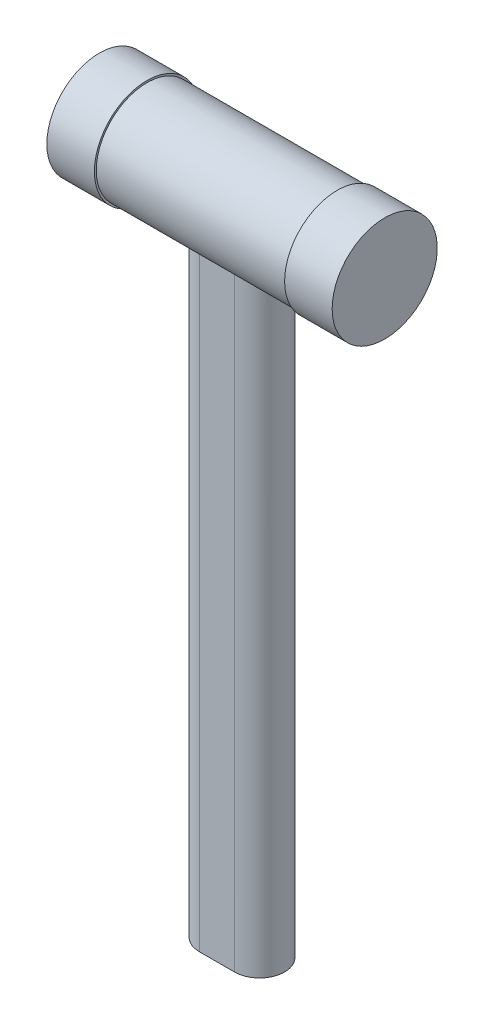
ISO-10303-21;
HEADER;
FILE_DESCRIPTION(('STEP AP214'),'2;1');
FILE_NAME('part.step','',(''),(''),'','','');
FILE_SCHEMA(('AUTOMOTIVE_DESIGN { 1 0 10303 214 1 1 1 1 }'));
ENDSEC;
DATA;
#1=APPLICATION_CONTEXT('core data for automotive mechanical design processes');
#2=APPLICATION_PROTOCOL_DEFINITION('international standard','automotive_design',2000,#1);
#3=PRODUCT_CONTEXT('',#1,'mechanical');
#4=PRODUCT('Part','Part','',(#3));
#5=PRODUCT_RELATED_PRODUCT_CATEGORY('part','',(#4));
#6=PRODUCT_DEFINITION_FORMATION('','',#4);
#7=PRODUCT_DEFINITION_CONTEXT('part definition',#1,'design');
#8=PRODUCT_DEFINITION('design','',#6,#7);
#9=PRODUCT_DEFINITION_SHAPE('','',#8);
#10=(LENGTH_UNIT() NAMED_UNIT(*) SI_UNIT(.MILLI.,.METRE.));
#11=(NAMED_UNIT(*) PLANE_ANGLE_UNIT() SI_UNIT($,.RADIAN.));
#12=(NAMED_UNIT(*) SI_UNIT($,.STERADIAN.) SOLID_ANGLE_UNIT());
#13=UNCERTAINTY_MEASURE_WITH_UNIT(LENGTH_MEASURE(1.E-05),#10,'distance_accuracy_value','');
#14=(GEOMETRIC_REPRESENTATION_CONTEXT(3) GLOBAL_UNCERTAINTY_ASSIGNED_CONTEXT((#13)) GLOBAL_UNIT_ASSIGNED_CONTEXT((#10,
#11,#12)) REPRESENTATION_CONTEXT('',''));
#15=CARTESIAN_POINT('',(0.,0.,0.));
#16=DIRECTION('',(0.,0.,1.));
#17=DIRECTION('',(1.,0.,0.));
#18=AXIS2_PLACEMENT_3D('',#15,#16,#17);
#19=CARTESIAN_POINT('',(-67.2475280945225,0.,0.));
#20=DIRECTION('',(-1.,0.,0.));
#21=DIRECTION('',(0.,0.,1.));
#22=AXIS2_PLACEMENT_3D('',#19,#20,#21);
#23=CYLINDRICAL_SURFACE('',#22,20.25);
#24=CARTESIAN_POINT('',(-7.,-17.6085916529403,10.));
#25=CARTESIAN_POINT('',(-7.13119469611353,-17.6085887085674,10.0000009562835));
#26=CARTESIAN_POINT('',(-7.26237096669667,-17.6100584813515,9.99741763580757));
#27=CARTESIAN_POINT('',(-7.52444877218274,-17.6159132625807,9.98709923847474));
#28=CARTESIAN_POINT('',(-7.65535032119536,-17.6202981174399,9.97936443303218));
#29=CARTESIAN_POINT('',(-8.04709113774775,-17.637770625517,9.94847458192275));
#30=CARTESIAN_POINT('',(-8.30718392901733,-17.6551763207532,9.91763404104645));
#31=CARTESIAN_POINT('',(-8.82172191477253,-17.7007291317959,9.83609851650981));
#32=CARTESIAN_POINT('',(-9.0761906004808,-17.7288154649931,9.78551584153814));
#33=CARTESIAN_POINT('',(-9.57926227381594,-17.7947435006415,9.66510776126199));
#34=CARTESIAN_POINT('',(-9.82786460819568,-17.8325862839782,9.59528022382229));
#35=CARTESIAN_POINT('',(-10.3170575060674,-17.9166803871335,9.43732161029125));
#36=CARTESIAN_POINT('',(-10.5576653041822,-17.9629120137454,9.34923333457524));
#37=CARTESIAN_POINT('',(-11.030223745024,-18.0624410057381,9.15546714449136));
#38=CARTESIAN_POINT('',(-11.2621709877771,-18.1157411094615,9.04978240914398));
#39=CARTESIAN_POINT('',(-11.9437340177426,-18.2841262909816,8.70735460386789));
#40=CARTESIAN_POINT('',(-12.3788157151471,-18.407649743781,8.44532126760743));
#41=CARTESIAN_POINT('',(-13.2353011040794,-18.6751854076638,7.83699797809553));
#42=CARTESIAN_POINT('',(-13.6528538958929,-18.8200459124759,7.48565872431166));
#43=CARTESIAN_POINT('',(-14.2324680791168,-19.0352031693265,6.91126544038948));
#44=CARTESIAN_POINT('',(-14.4179874827369,-19.1066102833636,6.71176518828111));
#45=CARTESIAN_POINT('',(-14.7724860926097,-19.2470138928763,6.29782791076951));
#46=CARTESIAN_POINT('',(-14.9414712835092,-19.3160112547162,6.08339633830036));
#47=CARTESIAN_POINT('',(-15.2724238948371,-19.454342164989,5.6259985323348));
#48=CARTESIAN_POINT('',(-15.4331969381054,-19.5233988129817,5.38208311950838));
#49=CARTESIAN_POINT('',(-15.7334660217533,-19.6549666094938,4.87977260064799));
#50=CARTESIAN_POINT('',(-15.8729608718957,-19.7174773917962,4.62137668572359));
#51=CARTESIAN_POINT('',(-16.1292376338619,-19.8341237283768,4.09188039767164));
#52=CARTESIAN_POINT('',(-16.2460301608737,-19.8882631944943,3.82078603604736));
#53=CARTESIAN_POINT('',(-16.4556490456701,-19.9865760546697,3.26773954131227));
#54=CARTESIAN_POINT('',(-16.5484778784218,-20.0307504778563,2.98578853293365));
#55=CARTESIAN_POINT('',(-16.7033875390429,-20.1050726351309,2.43326174131738));
#56=CARTESIAN_POINT('',(-16.7671603029062,-20.1359833248814,2.16326248898703));
#57=CARTESIAN_POINT('',(-16.8721553419112,-20.18712070987,1.61791206458623));
#58=CARTESIAN_POINT('',(-16.9133785767735,-20.2073478598042,1.34256112080333));
#59=CARTESIAN_POINT('',(-16.9727169559281,-20.2365243035953,0.788918292470951));
#60=CARTESIAN_POINT('',(-16.9908431716296,-20.2454790008057,0.510627881488825));
#61=CARTESIAN_POINT('',(-17.0037735113296,-20.2518628415792,-0.0466195808597257));
#62=CARTESIAN_POINT('',(-16.9985790162926,-20.2492926676017,-0.325576591774926));
#63=CARTESIAN_POINT('',(-16.9663784108316,-20.2334137760344,-0.858075358398231));
#64=CARTESIAN_POINT('',(-16.9412637337405,-20.2210363626956,-1.11176202804301));
#65=CARTESIAN_POINT('',(-16.8718663001748,-20.1870088973892,-1.61585199525056));
#66=CARTESIAN_POINT('',(-16.8275848591758,-20.1653594817896,-1.8662555169312));
#67=CARTESIAN_POINT('',(-16.7203323527073,-20.1133081641697,-2.36209317779882));
#68=CARTESIAN_POINT('',(-16.6573610377543,-20.0829061453146,-2.60752725060394));
#69=CARTESIAN_POINT('',(-16.5133659376076,-20.0140609814431,-3.09187861640992));
#70=CARTESIAN_POINT('',(-16.4323415125202,-19.9756175514014,-3.33079567807797));
#71=CARTESIAN_POINT('',(-16.251738322524,-19.8909704379378,-3.80399040846188));
#72=CARTESIAN_POINT('',(-16.1519183012321,-19.8446667227684,-4.03815811537233));
#73=CARTESIAN_POINT('',(-15.9353227454781,-19.7457145422005,-4.49716328221882));
#74=CARTESIAN_POINT('',(-15.8185411955624,-19.6930638269517,-4.72199739544196));
#75=CARTESIAN_POINT('',(-15.4440853089328,-19.5272817634961,-5.38073764441857));
#76=CARTESIAN_POINT('',(-15.1621929093053,-19.4062688251405,-5.799159142037));
#77=CARTESIAN_POINT('',(-14.5119417192443,-19.1414654815417,-6.6235492778595));
#78=CARTESIAN_POINT('',(-14.1379891319994,-18.996603497,-7.02476595586027));
#79=CARTESIAN_POINT('',(-13.5319189133597,-18.7801189681896,-7.5768707072095));
#80=CARTESIAN_POINT('',(-13.322188479109,-18.7080356060818,-7.75273808014846));
#81=CARTESIAN_POINT('',(-12.8884808337016,-18.565955930487,-8.08707110172042));
#82=CARTESIAN_POINT('',(-12.6645014744838,-18.4959599340226,-8.24553411673882));
#83=CARTESIAN_POINT('',(-12.1891474142513,-18.3557905007538,-8.55323357500701));
#84=CARTESIAN_POINT('',(-11.9369351132936,-18.2858734663001,-8.70129448320943));
#85=CARTESIAN_POINT('',(-11.4191770098272,-18.1529359822651,-8.97533319228321));
#86=CARTESIAN_POINT('',(-11.1536373826481,-18.0899123808158,-9.10132110153054));
#87=CARTESIAN_POINT('',(-10.6112332456041,-17.9731326323965,-9.32981517307728));
#88=CARTESIAN_POINT('',(-10.3343894964553,-17.9193603652161,-9.43236228499333));
#89=CARTESIAN_POINT('',(-9.77097324841326,-17.823127715097,-9.6129664289586));
#90=CARTESIAN_POINT('',(-9.48440503974579,-17.780662415072,-9.69103410906627));
#91=CARTESIAN_POINT('',(-9.01530688465895,-17.7226514787911,-9.79654031652647));
#92=CARTESIAN_POINT('',(-8.83502201646602,-17.7030274976721,-9.8319137326667));
#93=CARTESIAN_POINT('',(-8.47232088402276,-17.6691157375659,-9.89272778365913));
#94=CARTESIAN_POINT('',(-8.28990522372591,-17.6548264826158,-9.91817116594995));
#95=CARTESIAN_POINT('',(-7.92332191215859,-17.6318335238548,-9.9589922554542));
#96=CARTESIAN_POINT('',(-7.73915203078704,-17.6231382892473,-9.97435470108786));
#97=CARTESIAN_POINT('',(-7.36999100564903,-17.6115065672525,-9.99486666032168));
#98=CARTESIAN_POINT('',(-7.18499956549196,-17.6085723621322,-10.0000121264121));
#99=CARTESIAN_POINT('',(-7.,-17.6085916529403,-10.));
#100=B_SPLINE_CURVE_WITH_KNOTS('',3,(#24,#25,#26,#27,#28,#29,#30,#31,#32,#33,#34,#35,#36,#37,
#38,#39,#40,#41,#42,#43,#44,#45,#46,#47,#48,#49,#50,#51,#52,#53,#54,#55,#56,#57,#58,#59,#60,#61,
#62,#63,#64,#65,#66,#67,#68,#69,#70,#71,#72,#73,#74,#75,#76,#77,#78,#79,#80,#81,#82,#83,#84,#85,
#86,#87,#88,#89,#90,#91,#92,#93,#94,#95,#96,#97,#98,#99),.UNSPECIFIED.,.F.,.F.,(4,2,2,2,2,2,2,2,
2,2,2,2,2,2,2,2,2,2,2,2,2,2,2,2,2,2,2,2,2,2,2,2,2,2,2,2,2,4),(0.,0.393514021452711,
0.787007311622309,1.57334423069151,2.35527156505003,3.13728556386049,3.91748695578856,
4.69799148713889,6.25980931859988,7.94604918064989,8.79021658878735,9.63407730682369,
10.53349182625,11.4329566377442,12.3319998590077,13.2309501900289,14.0672552485545,
14.9035247107047,15.7393931614249,16.5752121158227,17.3399895601438,18.1047145236906,
18.8694496956967,19.6342119780952,20.4095578293316,21.1851793336473,22.7355269392181,
24.4296255662743,25.278015648434,26.126533931998,27.0274943155965,27.9280410178472,
28.8270022887464,29.7255719854635,30.2795594507784,30.8333935301696,31.3880641391161,
31.9429544399114),.UNSPECIFIED.);
#101=CARTESIAN_POINT('',(-7.,-17.6085916529403,10.));
#102=VERTEX_POINT('',#101);
#103=CARTESIAN_POINT('',(-7.,-17.6085916529404,-9.99999999999999));
#104=VERTEX_POINT('',#103);
#105=EDGE_CURVE('E11',#102,#104,#100,.T.);
#106=ORIENTED_EDGE('',*,*,#105,.F.);
#107=DIRECTION('',(-1.,0.,0.));
#108=VECTOR('',#107,1.);
#109=CARTESIAN_POINT('',(-67.2475280945225,-17.6085916529403,10.));
#110=LINE('',#109,#108);
#111=CARTESIAN_POINT('',(7.00000000000001,-17.6085916529403,10.));
#112=VERTEX_POINT('',#111);
#113=EDGE_CURVE('E85',#112,#102,#110,.T.);
#114=ORIENTED_EDGE('',*,*,#113,.F.);
#115=CARTESIAN_POINT('',(7.,-17.6085916529403,-10.));
#116=CARTESIAN_POINT('',(7.13119469611353,-17.6085887085674,-10.0000009562835));
#117=CARTESIAN_POINT('',(7.26237096669667,-17.6100584813515,-9.99741763580757));
#118=CARTESIAN_POINT('',(7.52444877218274,-17.6159132625807,-9.98709923847474));
#119=CARTESIAN_POINT('',(7.65535032119536,-17.6202981174399,-9.97936443303219));
#120=CARTESIAN_POINT('',(8.04709113774775,-17.637770625517,-9.94847458192275));
#121=CARTESIAN_POINT('',(8.30718392901732,-17.6551763207532,-9.91763404104645));
#122=CARTESIAN_POINT('',(8.82172191477252,-17.7007291317959,-9.83609851650981));
#123=CARTESIAN_POINT('',(9.07619060048079,-17.7288154649931,-9.78551584153814));
#124=CARTESIAN_POINT('',(9.57926227381593,-17.7947435006415,-9.665107761262));
#125=CARTESIAN_POINT('',(9.82786460819567,-17.8325862839782,-9.5952802238223));
#126=CARTESIAN_POINT('',(10.3170575060674,-17.9166803871335,-9.43732161029125));
#127=CARTESIAN_POINT('',(10.5576653041822,-17.9629120137454,-9.34923333457525));
#128=CARTESIAN_POINT('',(11.030223745024,-18.0624410057381,-9.15546714449137));
#129=CARTESIAN_POINT('',(11.2621709877771,-18.1157411094615,-9.04978240914399));
#130=CARTESIAN_POINT('',(11.9437340177426,-18.2841262909816,-8.7073546038679));
#131=CARTESIAN_POINT('',(12.3788157151471,-18.407649743781,-8.44532126760743));
#132=CARTESIAN_POINT('',(13.2353011040794,-18.6751854076638,-7.83699797809554));
#133=CARTESIAN_POINT('',(13.6528538958929,-18.8200459124759,-7.48565872431167));
#134=CARTESIAN_POINT('',(14.2324680791168,-19.0352031693265,-6.91126544038949));
#135=CARTESIAN_POINT('',(14.4179874827369,-19.1066102833636,-6.71176518828112));
#136=CARTESIAN_POINT('',(14.7724860926097,-19.2470138928763,-6.29782791076952));
#137=CARTESIAN_POINT('',(14.9414712835092,-19.3160112547162,-6.08339633830037));
#138=CARTESIAN_POINT('',(15.272423894837,-19.454342164989,-5.62599853233482));
#139=CARTESIAN_POINT('',(15.4331969381054,-19.5233988129817,-5.3820831195084));
#140=CARTESIAN_POINT('',(15.7334660217533,-19.6549666094938,-4.87977260064801));
#141=CARTESIAN_POINT('',(15.8729608718957,-19.7174773917962,-4.62137668572361));
#142=CARTESIAN_POINT('',(16.1292376338619,-19.8341237283767,-4.09188039767166));
#143=CARTESIAN_POINT('',(16.2460301608737,-19.8882631944943,-3.82078603604738));
#144=CARTESIAN_POINT('',(16.4556490456701,-19.9865760546697,-3.26773954131229));
#145=CARTESIAN_POINT('',(16.5484778784217,-20.0307504778563,-2.98578853293367));
#146=CARTESIAN_POINT('',(16.7033875390429,-20.1050726351309,-2.4332617413174));
#147=CARTESIAN_POINT('',(16.7671603029062,-20.1359833248814,-2.16326248898704));
#148=CARTESIAN_POINT('',(16.8721553419112,-20.18712070987,-1.61791206458625));
#149=CARTESIAN_POINT('',(16.9133785767735,-20.2073478598042,-1.34256112080335));
#150=CARTESIAN_POINT('',(16.9727169559281,-20.2365243035953,-0.788918292470969));
#151=CARTESIAN_POINT('',(16.9908431716296,-20.2454790008057,-0.510627881488843));
#152=CARTESIAN_POINT('',(17.0037735113296,-20.2518628415792,0.0466195808597077));
#153=CARTESIAN_POINT('',(16.9985790162926,-20.2492926676017,0.325576591774908));
#154=CARTESIAN_POINT('',(16.9663784108316,-20.2334137760344,0.858075358398214));
#155=CARTESIAN_POINT('',(16.9412637337405,-20.2210363626956,1.11176202804299));
#156=CARTESIAN_POINT('',(16.8718663001748,-20.1870088973892,1.61585199525054));
#157=CARTESIAN_POINT('',(16.8275848591758,-20.1653594817896,1.86625551693119));
#158=CARTESIAN_POINT('',(16.7203323527073,-20.1133081641697,2.36209317779881));
#159=CARTESIAN_POINT('',(16.6573610377543,-20.0829061453146,2.60752725060392));
#160=CARTESIAN_POINT('',(16.5133659376076,-20.0140609814431,3.09187861640991));
#161=CARTESIAN_POINT('',(16.4323415125202,-19.9756175514014,3.33079567807796));
#162=CARTESIAN_POINT('',(16.251738322524,-19.8909704379378,3.80399040846187));
#163=CARTESIAN_POINT('',(16.1519183012321,-19.8446667227684,4.03815811537231));
#164=CARTESIAN_POINT('',(15.9353227454781,-19.7457145422005,4.4971632822188));
#165=CARTESIAN_POINT('',(15.8185411955624,-19.6930638269517,4.72199739544194));
#166=CARTESIAN_POINT('',(15.4440853089328,-19.5272817634961,5.38073764441855));
#167=CARTESIAN_POINT('',(15.1621929093053,-19.4062688251405,5.79915914203698));
#168=CARTESIAN_POINT('',(14.5119417192443,-19.1414654815417,6.62354927785949));
#169=CARTESIAN_POINT('',(14.1379891319994,-18.996603497,7.02476595586026));
#170=CARTESIAN_POINT('',(13.5319189133598,-18.7801189681896,7.57687070720949));
#171=CARTESIAN_POINT('',(13.3221884791091,-18.7080356060818,7.75273808014844));
#172=CARTESIAN_POINT('',(12.8884808337016,-18.565955930487,8.08707110172041));
#173=CARTESIAN_POINT('',(12.6645014744838,-18.4959599340226,8.24553411673881));
#174=CARTESIAN_POINT('',(12.1891474142513,-18.3557905007538,8.553233575007));
#175=CARTESIAN_POINT('',(11.9369351132936,-18.2858734663001,8.70129448320941));
#176=CARTESIAN_POINT('',(11.4191770098273,-18.1529359822651,8.9753331922832));
#177=CARTESIAN_POINT('',(11.1536373826481,-18.0899123808158,9.10132110153052));
#178=CARTESIAN_POINT('',(10.6112332456041,-17.9731326323965,9.32981517307727));
#179=CARTESIAN_POINT('',(10.3343894964553,-17.9193603652161,9.43236228499333));
#180=CARTESIAN_POINT('',(9.77097324841328,-17.823127715097,9.6129664289586));
#181=CARTESIAN_POINT('',(9.48440503974581,-17.780662415072,9.69103410906626));
#182=CARTESIAN_POINT('',(9.01530688465896,-17.7226514787911,9.79654031652647));
#183=CARTESIAN_POINT('',(8.83502201646603,-17.7030274976721,9.8319137326667));
#184=CARTESIAN_POINT('',(8.47232088402277,-17.6691157375659,9.89272778365912));
#185=CARTESIAN_POINT('',(8.28990522372592,-17.6548264826157,9.91817116594995));
#186=CARTESIAN_POINT('',(7.92332191215859,-17.6318335238548,9.95899225545419));
#187=CARTESIAN_POINT('',(7.73915203078705,-17.6231382892473,9.97435470108785));
#188=CARTESIAN_POINT('',(7.36999100564904,-17.6115065672525,9.99486666032168));
#189=CARTESIAN_POINT('',(7.18499956549196,-17.6085723621322,10.0000121264121));
#190=CARTESIAN_POINT('',(7.,-17.6085916529403,10.));
#191=B_SPLINE_CURVE_WITH_KNOTS('',3,(#115,#116,#117,#118,#119,#120,#121,#122,#123,#124,#125,
#126,#127,#128,#129,#130,#131,#132,#133,#134,#135,#136,#137,#138,#139,#140,#141,#142,#143,#144,
#145,#146,#147,#148,#149,#150,#151,#152,#153,#154,#155,#156,#157,#158,#159,#160,#161,#162,#163,
#164,#165,#166,#167,#168,#169,#170,#171,#172,#173,#174,#175,#176,#177,#178,#179,#180,#181,#182,
#183,#184,#185,#186,#187,#188,#189,#190),.UNSPECIFIED.,.F.,.F.,(4,2,2,2,2,2,2,2,2,2,2,2,2,2,2,2,
2,2,2,2,2,2,2,2,2,2,2,2,2,2,2,2,2,2,2,2,2,4),(0.,0.393514021452712,0.78700731162231,
1.5733442306915,2.35527156505002,3.13728556386048,3.91748695578856,4.69799148713888,
6.25980931859987,7.94604918064988,8.79021658878734,9.63407730682368,10.53349182625,
11.4329566377442,12.3319998590077,13.2309501900289,14.0672552485545,14.9035247107047,
15.7393931614249,16.5752121158227,17.3399895601438,18.1047145236906,18.8694496956967,
19.6342119780952,20.4095578293315,21.1851793336473,22.7355269392181,24.4296255662743,
25.278015648434,26.1265339319979,27.0274943155964,27.9280410178472,28.8270022887464,
29.7255719854635,30.2795594507784,30.8333935301696,31.388064139116,31.9429544399114),.UNSPECIFIED.);
#192=CARTESIAN_POINT('',(7.,-17.6085916529403,-10.));
#193=VERTEX_POINT('',#192);
#194=EDGE_CURVE('E60',#193,#112,#191,.T.);
#195=ORIENTED_EDGE('',*,*,#194,.F.);
#196=DIRECTION('',(-1.,0.,0.));
#197=VECTOR('',#196,1.);
#198=CARTESIAN_POINT('',(-67.2475280945225,-17.6085916529404,-9.99999999999999));
#199=LINE('',#198,#197);
#200=EDGE_CURVE('E50',#104,#193,#199,.F.);
#201=ORIENTED_EDGE('',*,*,#200,.F.);
#202=EDGE_LOOP('',(#106,#114,#195,#201));
#203=FACE_BOUND('',#202,.T.);
#204=CARTESIAN_POINT('',(38.,0.,0.));
#205=DIRECTION('',(-1.,0.,0.));
#206=DIRECTION('',(0.,0.,1.));
#207=AXIS2_PLACEMENT_3D('',#204,#205,#206);
#208=CIRCLE('',#207,20.25);
#209=CARTESIAN_POINT('',(38.,0.,20.25));
#210=VERTEX_POINT('',#209);
#211=EDGE_CURVE('E109',#210,#210,#208,.T.);
#212=ORIENTED_EDGE('',*,*,#211,.T.);
#213=EDGE_LOOP('',(#212));
#214=FACE_BOUND('',#213,.T.);
#215=CARTESIAN_POINT('',(-38.,0.,0.));
#216=DIRECTION('',(-1.,0.,0.));
#217=DIRECTION('',(0.,0.,1.));
#218=AXIS2_PLACEMENT_3D('',#215,#216,#217);
#219=CIRCLE('',#218,20.25);
#220=CARTESIAN_POINT('',(-38.,0.,20.25));
#221=VERTEX_POINT('',#220);
#222=EDGE_CURVE('E128',#221,#221,#219,.T.);
#223=ORIENTED_EDGE('',*,*,#222,.F.);
#224=EDGE_LOOP('',(#223));
#225=FACE_BOUND('',#224,.T.);
#226=ADVANCED_FACE('F38',(#203,#214,#225),#23,.T.);
#227=CARTESIAN_POINT('',(-38.,0.,0.));
#228=DIRECTION('',(1.,0.,0.));
#229=DIRECTION('',(0.,0.,-1.));
#230=AXIS2_PLACEMENT_3D('',#227,#228,#229);
#231=PLANE('',#230);
#232=ORIENTED_EDGE('',*,*,#222,.T.);
#233=EDGE_LOOP('',(#232));
#234=FACE_BOUND('',#233,.T.);
#235=CARTESIAN_POINT('',(-38.,0.,0.));
#236=DIRECTION('',(-1.,0.,0.));
#237=DIRECTION('',(0.,0.,1.));
#238=AXIS2_PLACEMENT_3D('',#235,#236,#237);
#239=CIRCLE('',#238,21.);
#240=CARTESIAN_POINT('',(-38.,0.,21.));
#241=VERTEX_POINT('',#240);
#242=EDGE_CURVE('E125',#241,#241,#239,.T.);
#243=ORIENTED_EDGE('',*,*,#242,.F.);
#244=EDGE_LOOP('',(#243));
#245=FACE_BOUND('',#244,.T.);
#246=ADVANCED_FACE('F166',(#234,#245),#231,.T.);
#247=CARTESIAN_POINT('',(-67.2475280945225,0.,0.));
#248=DIRECTION('',(-1.,0.,0.));
#249=DIRECTION('',(0.,0.,1.));
#250=AXIS2_PLACEMENT_3D('',#247,#248,#249);
#251=CYLINDRICAL_SURFACE('',#250,21.);
#252=ORIENTED_EDGE('',*,*,#242,.T.);
#253=EDGE_LOOP('',(#252));
#254=FACE_BOUND('',#253,.T.);
#255=CARTESIAN_POINT('',(-57.,0.,0.));
#256=DIRECTION('',(-1.,0.,0.));
#257=DIRECTION('',(0.,0.,1.));
#258=AXIS2_PLACEMENT_3D('',#255,#256,#257);
#259=CIRCLE('',#258,21.);
#260=CARTESIAN_POINT('',(-57.,0.,21.));
#261=VERTEX_POINT('',#260);
#262=EDGE_CURVE('E122',#261,#261,#259,.T.);
#263=ORIENTED_EDGE('',*,*,#262,.F.);
#264=EDGE_LOOP('',(#263));
#265=FACE_BOUND('',#264,.T.);
#266=ADVANCED_FACE('F163',(#254,#265),#251,.T.);
#267=CARTESIAN_POINT('',(-57.,0.,0.));
#268=DIRECTION('',(-1.,0.,0.));
#269=DIRECTION('',(0.,0.,1.));
#270=AXIS2_PLACEMENT_3D('',#267,#268,#269);
#271=PLANE('',#270);
#272=ORIENTED_EDGE('',*,*,#262,.T.);
#273=EDGE_LOOP('',(#272));
#274=FACE_BOUND('',#273,.T.);
#275=ADVANCED_FACE('F159',(#274),#271,.T.);
#276=CARTESIAN_POINT('',(57.,0.,0.));
#277=DIRECTION('',(1.,0.,0.));
#278=DIRECTION('',(0.,0.,-1.));
#279=AXIS2_PLACEMENT_3D('',#276,#277,#278);
#280=PLANE('',#279);
#281=CARTESIAN_POINT('',(57.,0.,0.));
#282=DIRECTION('',(-1.,0.,0.));
#283=DIRECTION('',(0.,0.,1.));
#284=AXIS2_PLACEMENT_3D('',#281,#282,#283);
#285=CIRCLE('',#284,21.);
#286=CARTESIAN_POINT('',(57.,0.,21.));
#287=VERTEX_POINT('',#286);
#288=EDGE_CURVE('E119',#287,#287,#285,.T.);
#289=ORIENTED_EDGE('',*,*,#288,.F.);
#290=EDGE_LOOP('',(#289));
#291=FACE_BOUND('',#290,.T.);
#292=ADVANCED_FACE('F155',(#291),#280,.T.);
#293=CARTESIAN_POINT('',(-67.2475280945225,0.,0.));
#294=DIRECTION('',(-1.,0.,0.));
#295=DIRECTION('',(0.,0.,1.));
#296=AXIS2_PLACEMENT_3D('',#293,#294,#295);
#297=CYLINDRICAL_SURFACE('',#296,21.);
#298=ORIENTED_EDGE('',*,*,#288,.T.);
#299=EDGE_LOOP('',(#298));
#300=FACE_BOUND('',#299,.T.);
#301=CARTESIAN_POINT('',(38.,0.,0.));
#302=DIRECTION('',(-1.,0.,0.));
#303=DIRECTION('',(0.,0.,1.));
#304=AXIS2_PLACEMENT_3D('',#301,#302,#303);
#305=CIRCLE('',#304,21.);
#306=CARTESIAN_POINT('',(38.,0.,21.));
#307=VERTEX_POINT('',#306);
#308=EDGE_CURVE('E116',#307,#307,#305,.T.);
#309=ORIENTED_EDGE('',*,*,#308,.F.);
#310=EDGE_LOOP('',(#309));
#311=FACE_BOUND('',#310,.T.);
#312=ADVANCED_FACE('F151',(#300,#311),#297,.T.);
#313=CARTESIAN_POINT('',(38.,0.,0.));
#314=DIRECTION('',(1.,0.,0.));
#315=DIRECTION('',(0.,0.,-1.));
#316=AXIS2_PLACEMENT_3D('',#313,#314,#315);
#317=PLANE('',#316);
#318=ORIENTED_EDGE('',*,*,#211,.F.);
#319=EDGE_LOOP('',(#318));
#320=FACE_BOUND('',#319,.T.);
#321=ORIENTED_EDGE('',*,*,#308,.T.);
#322=EDGE_LOOP('',(#321));
#323=FACE_BOUND('',#322,.T.);
#324=ADVANCED_FACE('F148',(#320,#323),#317,.F.);
#325=CARTESIAN_POINT('',(-7.,-260.,0.));
#326=DIRECTION('',(0.,1.,0.));
#327=DIRECTION('',(0.,0.,1.));
#328=AXIS2_PLACEMENT_3D('',#325,#326,#327);
#329=CYLINDRICAL_SURFACE('',#328,10.);
#330=DIRECTION('',(0.,1.,0.));
#331=VECTOR('',#330,1.);
#332=CARTESIAN_POINT('',(-7.,-260.,10.));
#333=LINE('',#332,#331);
#334=CARTESIAN_POINT('',(-7.,-260.,10.));
#335=VERTEX_POINT('',#334);
#336=EDGE_CURVE('E80',#335,#102,#333,.T.);
#337=ORIENTED_EDGE('',*,*,#336,.T.);
#338=ORIENTED_EDGE('',*,*,#105,.T.);
#339=DIRECTION('',(0.,1.,0.));
#340=VECTOR('',#339,1.);
#341=CARTESIAN_POINT('',(-7.,-260.,-10.));
#342=LINE('',#341,#340);
#343=CARTESIAN_POINT('',(-7.,-260.,-10.));
#344=VERTEX_POINT('',#343);
#345=EDGE_CURVE('E103',#344,#104,#342,.T.);
#346=ORIENTED_EDGE('',*,*,#345,.F.);
#347=CARTESIAN_POINT('',(-7.,-260.,0.));
#348=DIRECTION('',(0.,1.,0.));
#349=DIRECTION('',(0.,0.,1.));
#350=AXIS2_PLACEMENT_3D('',#347,#348,#349);
#351=CIRCLE('',#350,10.);
#352=EDGE_CURVE('E96',#344,#335,#351,.T.);
#353=ORIENTED_EDGE('',*,*,#352,.T.);
#354=EDGE_LOOP('',(#337,#338,#346,#353));
#355=FACE_BOUND('',#354,.T.);
#356=ADVANCED_FACE('F101',(#355),#329,.T.);
#357=CARTESIAN_POINT('',(-7.,-260.,-10.));
#358=DIRECTION('',(0.,0.,-1.));
#359=DIRECTION('',(-1.,0.,0.));
#360=AXIS2_PLACEMENT_3D('',#357,#358,#359);
#361=PLANE('',#360);
#362=ORIENTED_EDGE('',*,*,#345,.T.);
#363=ORIENTED_EDGE('',*,*,#200,.T.);
#364=DIRECTION('',(0.,1.,0.));
#365=VECTOR('',#364,1.);
#366=CARTESIAN_POINT('',(7.,-260.,-10.));
#367=LINE('',#366,#365);
#368=CARTESIAN_POINT('',(7.,-260.,-10.));
#369=VERTEX_POINT('',#368);
#370=EDGE_CURVE('E110',#369,#193,#367,.T.);
#371=ORIENTED_EDGE('',*,*,#370,.F.);
#372=DIRECTION('',(-1.,0.,0.));
#373=VECTOR('',#372,1.);
#374=CARTESIAN_POINT('',(-7.,-260.,-10.));
#375=LINE('',#374,#373);
#376=EDGE_CURVE('E89',#369,#344,#375,.T.);
#377=ORIENTED_EDGE('',*,*,#376,.T.);
#378=EDGE_LOOP('',(#362,#363,#371,#377));
#379=FACE_BOUND('',#378,.T.);
#380=ADVANCED_FACE('F141',(#379),#361,.T.);
#381=CARTESIAN_POINT('',(7.,-260.,0.));
#382=DIRECTION('',(0.,1.,0.));
#383=DIRECTION('',(0.,0.,1.));
#384=AXIS2_PLACEMENT_3D('',#381,#382,#383);
#385=CYLINDRICAL_SURFACE('',#384,10.);
#386=ORIENTED_EDGE('',*,*,#370,.T.);
#387=ORIENTED_EDGE('',*,*,#194,.T.);
#388=DIRECTION('',(0.,1.,0.));
#389=VECTOR('',#388,1.);
#390=CARTESIAN_POINT('',(7.,-260.,10.));
#391=LINE('',#390,#389);
#392=CARTESIAN_POINT('',(7.,-260.,10.));
#393=VERTEX_POINT('',#392);
#394=EDGE_CURVE('E88',#393,#112,#391,.T.);
#395=ORIENTED_EDGE('',*,*,#394,.F.);
#396=CARTESIAN_POINT('',(7.,-260.,0.));
#397=DIRECTION('',(0.,1.,0.));
#398=DIRECTION('',(0.,0.,1.));
#399=AXIS2_PLACEMENT_3D('',#396,#397,#398);
#400=CIRCLE('',#399,10.);
#401=EDGE_CURVE('E99',#393,#369,#400,.T.);
#402=ORIENTED_EDGE('',*,*,#401,.T.);
#403=EDGE_LOOP('',(#386,#387,#395,#402));
#404=FACE_BOUND('',#403,.T.);
#405=ADVANCED_FACE('F136',(#404),#385,.T.);
#406=CARTESIAN_POINT('',(-7.,-260.,10.));
#407=DIRECTION('',(0.,0.,1.));
#408=DIRECTION('',(1.,0.,0.));
#409=AXIS2_PLACEMENT_3D('',#406,#407,#408);
#410=PLANE('',#409);
#411=ORIENTED_EDGE('',*,*,#394,.T.);
#412=ORIENTED_EDGE('',*,*,#113,.T.);
#413=ORIENTED_EDGE('',*,*,#336,.F.);
#414=DIRECTION('',(1.,0.,0.));
#415=VECTOR('',#414,1.);
#416=CARTESIAN_POINT('',(-7.,-260.,10.));
#417=LINE('',#416,#415);
#418=EDGE_CURVE('E84',#335,#393,#417,.T.);
#419=ORIENTED_EDGE('',*,*,#418,.T.);
#420=EDGE_LOOP('',(#411,#412,#413,#419));
#421=FACE_BOUND('',#420,.T.);
#422=ADVANCED_FACE('F83',(#421),#410,.T.);
#423=CARTESIAN_POINT('',(-7.,-260.,0.));
#424=DIRECTION('',(0.,1.,0.));
#425=DIRECTION('',(0.,0.,1.));
#426=AXIS2_PLACEMENT_3D('',#423,#424,#425);
#427=PLANE('',#426);
#428=ORIENTED_EDGE('',*,*,#352,.F.);
#429=ORIENTED_EDGE('',*,*,#376,.F.);
#430=ORIENTED_EDGE('',*,*,#401,.F.);
#431=ORIENTED_EDGE('',*,*,#418,.F.);
#432=EDGE_LOOP('',(#428,#429,#430,#431));
#433=FACE_BOUND('',#432,.T.);
#434=ADVANCED_FACE('F94',(#433),#427,.F.);
#435=CLOSED_SHELL('',(#226,#246,#266,#275,#292,#312,#324,#356,#380,#405,#422,#434));
#436=MANIFOLD_SOLID_BREP('B2',#435);
#437=ADVANCED_BREP_SHAPE_REPRESENTATION('',(#18,#436),#14);
#438=SHAPE_DEFINITION_REPRESENTATION(#9,#437);
ENDSEC;
END-ISO-10303-21;
